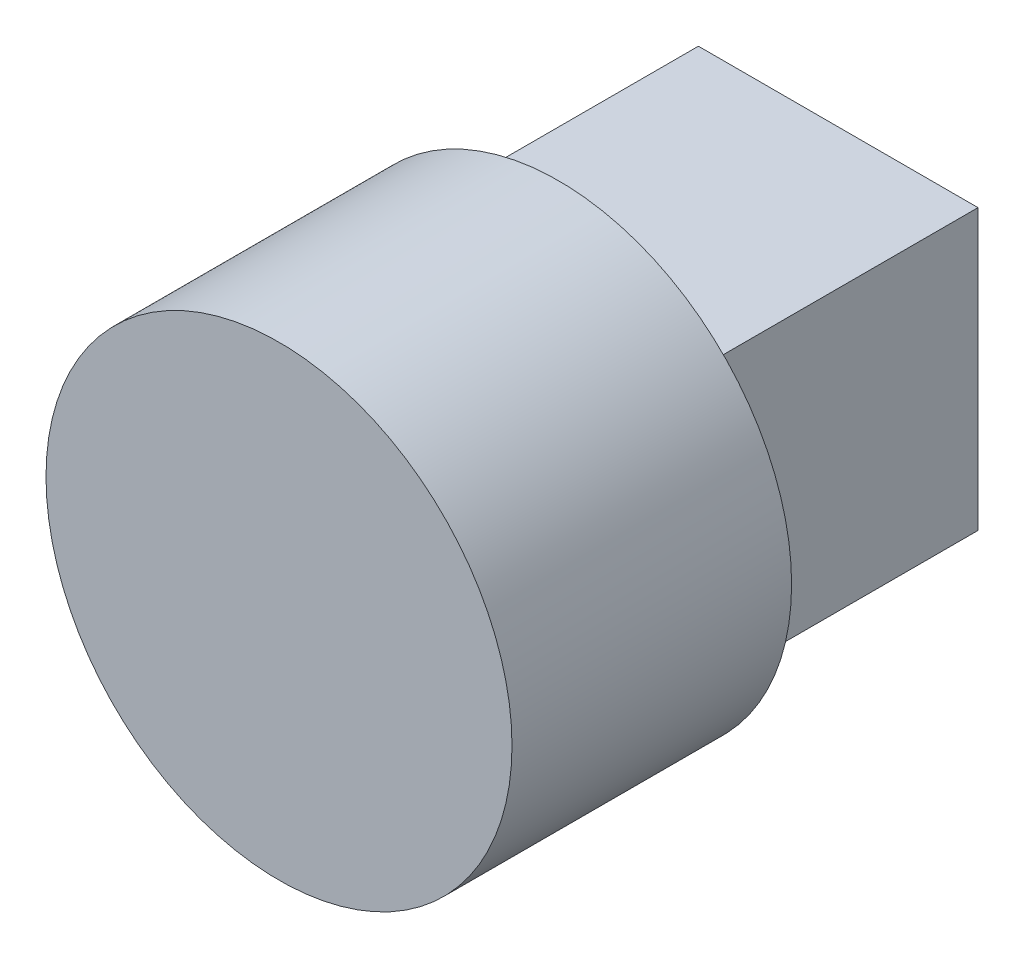
ISO-10303-21;
HEADER;
FILE_DESCRIPTION(('STEP AP214'),'2;1');
FILE_NAME('part.step','',(''),(''),'','','');
FILE_SCHEMA(('AUTOMOTIVE_DESIGN { 1 0 10303 214 1 1 1 1 }'));
ENDSEC;
DATA;
#1=APPLICATION_CONTEXT('core data for automotive mechanical design processes');
#2=APPLICATION_PROTOCOL_DEFINITION('international standard','automotive_design',2000,#1);
#3=PRODUCT_CONTEXT('',#1,'mechanical');
#4=PRODUCT('Part','Part','',(#3));
#5=PRODUCT_RELATED_PRODUCT_CATEGORY('part','',(#4));
#6=PRODUCT_DEFINITION_FORMATION('','',#4);
#7=PRODUCT_DEFINITION_CONTEXT('part definition',#1,'design');
#8=PRODUCT_DEFINITION('design','',#6,#7);
#9=PRODUCT_DEFINITION_SHAPE('','',#8);
#10=(LENGTH_UNIT() NAMED_UNIT(*) SI_UNIT(.MILLI.,.METRE.));
#11=(NAMED_UNIT(*) PLANE_ANGLE_UNIT() SI_UNIT($,.RADIAN.));
#12=(NAMED_UNIT(*) SI_UNIT($,.STERADIAN.) SOLID_ANGLE_UNIT());
#13=UNCERTAINTY_MEASURE_WITH_UNIT(LENGTH_MEASURE(1.E-05),#10,'distance_accuracy_value','');
#14=(GEOMETRIC_REPRESENTATION_CONTEXT(3) GLOBAL_UNCERTAINTY_ASSIGNED_CONTEXT((#13)) GLOBAL_UNIT_ASSIGNED_CONTEXT((#10,
#11,#12)) REPRESENTATION_CONTEXT('',''));
#15=CARTESIAN_POINT('',(0.,0.,0.));
#16=DIRECTION('',(0.,0.,1.));
#17=DIRECTION('',(1.,0.,0.));
#18=AXIS2_PLACEMENT_3D('',#15,#16,#17);
#19=CARTESIAN_POINT('',(1.5,-1.5,3.));
#20=DIRECTION('',(0.,1.,0.));
#21=DIRECTION('',(0.,0.,1.));
#22=AXIS2_PLACEMENT_3D('',#19,#20,#21);
#23=PLANE('',#22);
#24=DIRECTION('',(1.,0.,0.));
#25=VECTOR('',#24,1.);
#26=CARTESIAN_POINT('',(1.5,-1.5,0.));
#27=LINE('',#26,#25);
#28=CARTESIAN_POINT('',(-1.5,-1.5,0.));
#29=VERTEX_POINT('',#28);
#30=CARTESIAN_POINT('',(1.5,-1.5,0.));
#31=VERTEX_POINT('',#30);
#32=EDGE_CURVE('E100',#29,#31,#27,.T.);
#33=ORIENTED_EDGE('',*,*,#32,.T.);
#34=DIRECTION('',(0.,0.,-1.));
#35=VECTOR('',#34,1.);
#36=CARTESIAN_POINT('',(1.5,-1.5,3.));
#37=LINE('',#36,#35);
#38=CARTESIAN_POINT('',(1.5,-1.5,3.));
#39=VERTEX_POINT('',#38);
#40=EDGE_CURVE('E40',#39,#31,#37,.T.);
#41=ORIENTED_EDGE('',*,*,#40,.F.);
#42=DIRECTION('',(1.,0.,0.));
#43=VECTOR('',#42,1.);
#44=CARTESIAN_POINT('',(1.5,-1.5,3.));
#45=LINE('',#44,#43);
#46=CARTESIAN_POINT('',(-1.5,-1.5,3.));
#47=VERTEX_POINT('',#46);
#48=EDGE_CURVE('E82',#47,#39,#45,.T.);
#49=ORIENTED_EDGE('',*,*,#48,.F.);
#50=DIRECTION('',(0.,0.,-1.));
#51=VECTOR('',#50,1.);
#52=CARTESIAN_POINT('',(-1.5,-1.5,3.));
#53=LINE('',#52,#51);
#54=EDGE_CURVE('E11',#47,#29,#53,.T.);
#55=ORIENTED_EDGE('',*,*,#54,.T.);
#56=EDGE_LOOP('',(#33,#41,#49,#55));
#57=FACE_BOUND('',#56,.T.);
#58=ADVANCED_FACE('F32',(#57),#23,.F.);
#59=CARTESIAN_POINT('',(1.5,1.5,3.));
#60=DIRECTION('',(-1.,0.,0.));
#61=DIRECTION('',(0.,-1.,0.));
#62=AXIS2_PLACEMENT_3D('',#59,#60,#61);
#63=PLANE('',#62);
#64=DIRECTION('',(0.,1.,0.));
#65=VECTOR('',#64,1.);
#66=CARTESIAN_POINT('',(1.5,1.5,0.));
#67=LINE('',#66,#65);
#68=CARTESIAN_POINT('',(1.5,1.5,0.));
#69=VERTEX_POINT('',#68);
#70=EDGE_CURVE('E66',#31,#69,#67,.T.);
#71=ORIENTED_EDGE('',*,*,#70,.T.);
#72=DIRECTION('',(0.,0.,-1.));
#73=VECTOR('',#72,1.);
#74=CARTESIAN_POINT('',(1.5,1.5,3.));
#75=LINE('',#74,#73);
#76=CARTESIAN_POINT('',(1.5,1.5,3.));
#77=VERTEX_POINT('',#76);
#78=EDGE_CURVE('E106',#77,#69,#75,.T.);
#79=ORIENTED_EDGE('',*,*,#78,.F.);
#80=DIRECTION('',(0.,1.,0.));
#81=VECTOR('',#80,1.);
#82=CARTESIAN_POINT('',(1.5,1.5,3.));
#83=LINE('',#82,#81);
#84=EDGE_CURVE('E85',#39,#77,#83,.T.);
#85=ORIENTED_EDGE('',*,*,#84,.F.);
#86=ORIENTED_EDGE('',*,*,#40,.T.);
#87=EDGE_LOOP('',(#71,#79,#85,#86));
#88=FACE_BOUND('',#87,.T.);
#89=ADVANCED_FACE('F107',(#88),#63,.F.);
#90=CARTESIAN_POINT('',(-1.5,1.5,3.));
#91=DIRECTION('',(0.,-1.,0.));
#92=DIRECTION('',(0.,0.,-1.));
#93=AXIS2_PLACEMENT_3D('',#90,#91,#92);
#94=PLANE('',#93);
#95=DIRECTION('',(-1.,0.,0.));
#96=VECTOR('',#95,1.);
#97=CARTESIAN_POINT('',(-1.5,1.5,0.));
#98=LINE('',#97,#96);
#99=CARTESIAN_POINT('',(-1.5,1.5,0.));
#100=VERTEX_POINT('',#99);
#101=EDGE_CURVE('E71',#69,#100,#98,.T.);
#102=ORIENTED_EDGE('',*,*,#101,.T.);
#103=DIRECTION('',(0.,0.,-1.));
#104=VECTOR('',#103,1.);
#105=CARTESIAN_POINT('',(-1.5,1.5,3.));
#106=LINE('',#105,#104);
#107=CARTESIAN_POINT('',(-1.5,1.5,3.));
#108=VERTEX_POINT('',#107);
#109=EDGE_CURVE('E99',#108,#100,#106,.T.);
#110=ORIENTED_EDGE('',*,*,#109,.F.);
#111=DIRECTION('',(-1.,0.,0.));
#112=VECTOR('',#111,1.);
#113=CARTESIAN_POINT('',(-1.5,1.5,3.));
#114=LINE('',#113,#112);
#115=EDGE_CURVE('E90',#77,#108,#114,.T.);
#116=ORIENTED_EDGE('',*,*,#115,.F.);
#117=ORIENTED_EDGE('',*,*,#78,.T.);
#118=EDGE_LOOP('',(#102,#110,#116,#117));
#119=FACE_BOUND('',#118,.T.);
#120=ADVANCED_FACE('F119',(#119),#94,.F.);
#121=CARTESIAN_POINT('',(-1.5,0.,3.));
#122=DIRECTION('',(1.,0.,0.));
#123=DIRECTION('',(0.,0.,-1.));
#124=AXIS2_PLACEMENT_3D('',#121,#122,#123);
#125=PLANE('',#124);
#126=DIRECTION('',(0.,-1.,0.));
#127=VECTOR('',#126,1.);
#128=CARTESIAN_POINT('',(-1.5,0.,0.));
#129=LINE('',#128,#127);
#130=EDGE_CURVE('E79',#100,#29,#129,.T.);
#131=ORIENTED_EDGE('',*,*,#130,.T.);
#132=ORIENTED_EDGE('',*,*,#54,.F.);
#133=DIRECTION('',(0.,-1.,0.));
#134=VECTOR('',#133,1.);
#135=CARTESIAN_POINT('',(-1.5,-1.5,3.));
#136=LINE('',#135,#134);
#137=EDGE_CURVE('E48',#108,#47,#136,.T.);
#138=ORIENTED_EDGE('',*,*,#137,.F.);
#139=ORIENTED_EDGE('',*,*,#109,.T.);
#140=EDGE_LOOP('',(#131,#132,#138,#139));
#141=FACE_BOUND('',#140,.T.);
#142=ADVANCED_FACE('F77',(#141),#125,.F.);
#143=CARTESIAN_POINT('',(0.,0.,0.));
#144=DIRECTION('',(0.,0.,-1.));
#145=DIRECTION('',(-1.,0.,0.));
#146=AXIS2_PLACEMENT_3D('',#143,#144,#145);
#147=PLANE('',#146);
#148=ORIENTED_EDGE('',*,*,#32,.F.);
#149=ORIENTED_EDGE('',*,*,#130,.F.);
#150=ORIENTED_EDGE('',*,*,#101,.F.);
#151=ORIENTED_EDGE('',*,*,#70,.F.);
#152=EDGE_LOOP('',(#148,#149,#150,#151));
#153=FACE_BOUND('',#152,.T.);
#154=ADVANCED_FACE('F109',(#153),#147,.T.);
#155=CARTESIAN_POINT('',(0.,0.,3.));
#156=DIRECTION('',(0.,0.,1.));
#157=DIRECTION('',(1.,0.,0.));
#158=AXIS2_PLACEMENT_3D('',#155,#156,#157);
#159=PLANE('',#158);
#160=CARTESIAN_POINT('',(0.,0.,3.));
#161=DIRECTION('',(0.,0.,1.));
#162=DIRECTION('',(1.,0.,0.));
#163=AXIS2_PLACEMENT_3D('',#160,#161,#162);
#164=CIRCLE('',#163,2.5);
#165=CARTESIAN_POINT('',(2.5,0.,3.));
#166=VERTEX_POINT('',#165);
#167=EDGE_CURVE('E94',#166,#166,#164,.T.);
#168=ORIENTED_EDGE('',*,*,#167,.F.);
#169=EDGE_LOOP('',(#168));
#170=FACE_BOUND('',#169,.T.);
#171=ORIENTED_EDGE('',*,*,#137,.T.);
#172=ORIENTED_EDGE('',*,*,#48,.T.);
#173=ORIENTED_EDGE('',*,*,#84,.T.);
#174=ORIENTED_EDGE('',*,*,#115,.T.);
#175=EDGE_LOOP('',(#171,#172,#173,#174));
#176=FACE_BOUND('',#175,.T.);
#177=ADVANCED_FACE('F88',(#170,#176),#159,.F.);
#178=CARTESIAN_POINT('',(0.,0.,6.));
#179=DIRECTION('',(0.,0.,-1.));
#180=DIRECTION('',(-1.,0.,0.));
#181=AXIS2_PLACEMENT_3D('',#178,#179,#180);
#182=CYLINDRICAL_SURFACE('',#181,2.5);
#183=CARTESIAN_POINT('',(0.,0.,6.));
#184=DIRECTION('',(0.,0.,1.));
#185=DIRECTION('',(1.,0.,0.));
#186=AXIS2_PLACEMENT_3D('',#183,#184,#185);
#187=CIRCLE('',#186,2.5);
#188=CARTESIAN_POINT('',(2.5,0.,6.));
#189=VERTEX_POINT('',#188);
#190=EDGE_CURVE('E102',#189,#189,#187,.T.);
#191=ORIENTED_EDGE('',*,*,#190,.F.);
#192=EDGE_LOOP('',(#191));
#193=FACE_BOUND('',#192,.T.);
#194=ORIENTED_EDGE('',*,*,#167,.T.);
#195=EDGE_LOOP('',(#194));
#196=FACE_BOUND('',#195,.T.);
#197=ADVANCED_FACE('F116',(#193,#196),#182,.T.);
#198=CARTESIAN_POINT('',(0.,0.,6.));
#199=DIRECTION('',(0.,0.,1.));
#200=DIRECTION('',(1.,0.,0.));
#201=AXIS2_PLACEMENT_3D('',#198,#199,#200);
#202=PLANE('',#201);
#203=ORIENTED_EDGE('',*,*,#190,.T.);
#204=EDGE_LOOP('',(#203));
#205=FACE_BOUND('',#204,.T.);
#206=ADVANCED_FACE('F153',(#205),#202,.T.);
#207=CLOSED_SHELL('',(#58,#89,#120,#142,#154,#177,#197,#206));
#208=MANIFOLD_SOLID_BREP('B2',#207);
#209=ADVANCED_BREP_SHAPE_REPRESENTATION('',(#18,#208),#14);
#210=SHAPE_DEFINITION_REPRESENTATION(#9,#209);
ENDSEC;
END-ISO-10303-21;
